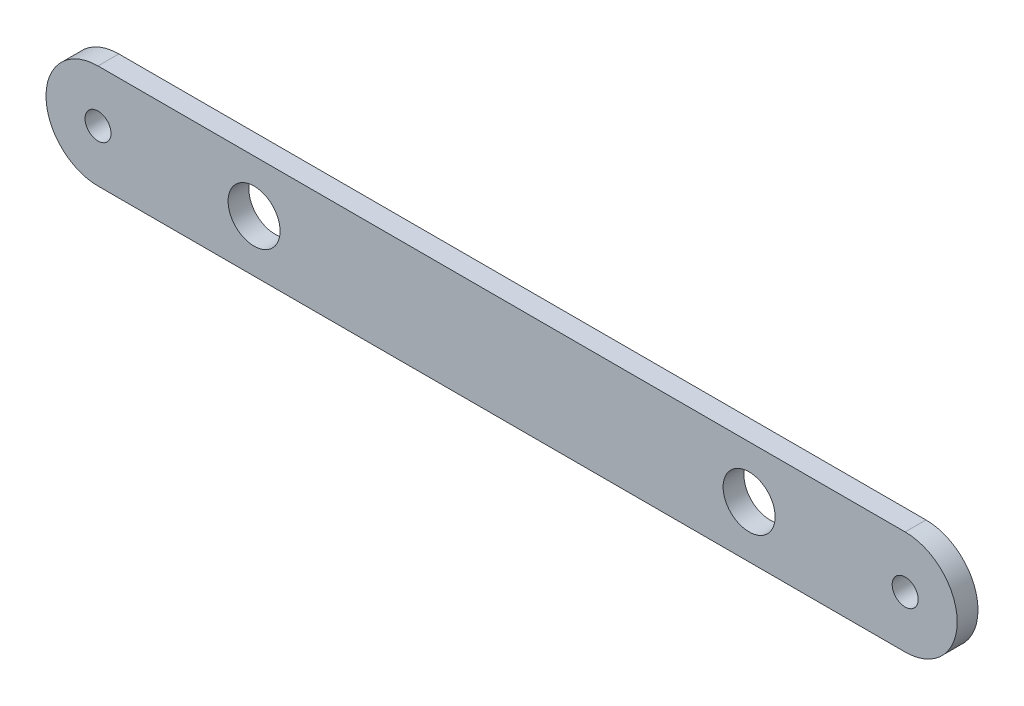
ISO-10303-21;
HEADER;
FILE_DESCRIPTION(('STEP AP214'),'2;1');
FILE_NAME('part.step','',(''),(''),'','','');
FILE_SCHEMA(('AUTOMOTIVE_DESIGN { 1 0 10303 214 1 1 1 1 }'));
ENDSEC;
DATA;
#1=APPLICATION_CONTEXT('core data for automotive mechanical design processes');
#2=APPLICATION_PROTOCOL_DEFINITION('international standard','automotive_design',2000,#1);
#3=PRODUCT_CONTEXT('',#1,'mechanical');
#4=PRODUCT('Part','Part','',(#3));
#5=PRODUCT_RELATED_PRODUCT_CATEGORY('part','',(#4));
#6=PRODUCT_DEFINITION_FORMATION('','',#4);
#7=PRODUCT_DEFINITION_CONTEXT('part definition',#1,'design');
#8=PRODUCT_DEFINITION('design','',#6,#7);
#9=PRODUCT_DEFINITION_SHAPE('','',#8);
#10=(LENGTH_UNIT() NAMED_UNIT(*) SI_UNIT(.MILLI.,.METRE.));
#11=(NAMED_UNIT(*) PLANE_ANGLE_UNIT() SI_UNIT($,.RADIAN.));
#12=(NAMED_UNIT(*) SI_UNIT($,.STERADIAN.) SOLID_ANGLE_UNIT());
#13=UNCERTAINTY_MEASURE_WITH_UNIT(LENGTH_MEASURE(1.E-05),#10,'distance_accuracy_value','');
#14=(GEOMETRIC_REPRESENTATION_CONTEXT(3) GLOBAL_UNCERTAINTY_ASSIGNED_CONTEXT((#13)) GLOBAL_UNIT_ASSIGNED_CONTEXT((#10,
#11,#12)) REPRESENTATION_CONTEXT('',''));
#15=CARTESIAN_POINT('',(0.,0.,0.));
#16=DIRECTION('',(0.,0.,1.));
#17=DIRECTION('',(1.,0.,0.));
#18=AXIS2_PLACEMENT_3D('',#15,#16,#17);
#19=CARTESIAN_POINT('',(0.,0.,2.54));
#20=DIRECTION('',(0.,0.,-1.));
#21=DIRECTION('',(-1.,0.,0.));
#22=AXIS2_PLACEMENT_3D('',#19,#20,#21);
#23=CYLINDRICAL_SURFACE('',#22,6.35);
#24=CARTESIAN_POINT('',(0.,0.,0.));
#25=DIRECTION('',(0.,0.,1.));
#26=DIRECTION('',(1.,0.,0.));
#27=AXIS2_PLACEMENT_3D('',#24,#25,#26);
#28=CIRCLE('',#27,6.35);
#29=CARTESIAN_POINT('',(0.,6.35,0.));
#30=VERTEX_POINT('',#29);
#31=CARTESIAN_POINT('',(0.,-6.35,0.));
#32=VERTEX_POINT('',#31);
#33=EDGE_CURVE('E122',#30,#32,#28,.T.);
#34=ORIENTED_EDGE('',*,*,#33,.T.);
#35=DIRECTION('',(0.,0.,-1.));
#36=VECTOR('',#35,1.);
#37=CARTESIAN_POINT('',(0.,-6.35,2.54));
#38=LINE('',#37,#36);
#39=CARTESIAN_POINT('',(0.,-6.35,2.54));
#40=VERTEX_POINT('',#39);
#41=EDGE_CURVE('E11',#40,#32,#38,.T.);
#42=ORIENTED_EDGE('',*,*,#41,.F.);
#43=CARTESIAN_POINT('',(0.,0.,2.54));
#44=DIRECTION('',(0.,0.,1.));
#45=DIRECTION('',(1.,0.,0.));
#46=AXIS2_PLACEMENT_3D('',#43,#44,#45);
#47=CIRCLE('',#46,6.35);
#48=CARTESIAN_POINT('',(0.,6.35,2.54));
#49=VERTEX_POINT('',#48);
#50=EDGE_CURVE('E93',#49,#40,#47,.T.);
#51=ORIENTED_EDGE('',*,*,#50,.F.);
#52=DIRECTION('',(0.,0.,-1.));
#53=VECTOR('',#52,1.);
#54=CARTESIAN_POINT('',(0.,6.35,2.54));
#55=LINE('',#54,#53);
#56=EDGE_CURVE('E59',#49,#30,#55,.T.);
#57=ORIENTED_EDGE('',*,*,#56,.T.);
#58=EDGE_LOOP('',(#34,#42,#51,#57));
#59=FACE_BOUND('',#58,.T.);
#60=ADVANCED_FACE('F42',(#59),#23,.T.);
#61=CARTESIAN_POINT('',(0.,-6.35,2.54));
#62=DIRECTION('',(0.,1.,0.));
#63=DIRECTION('',(0.,0.,1.));
#64=AXIS2_PLACEMENT_3D('',#61,#62,#63);
#65=PLANE('',#64);
#66=DIRECTION('',(1.,0.,0.));
#67=VECTOR('',#66,1.);
#68=CARTESIAN_POINT('',(0.,-6.35,0.));
#69=LINE('',#68,#67);
#70=CARTESIAN_POINT('',(98.5266,-6.35,0.));
#71=VERTEX_POINT('',#70);
#72=EDGE_CURVE('E98',#32,#71,#69,.T.);
#73=ORIENTED_EDGE('',*,*,#72,.T.);
#74=DIRECTION('',(0.,0.,-1.));
#75=VECTOR('',#74,1.);
#76=CARTESIAN_POINT('',(98.5266,-6.35,2.54));
#77=LINE('',#76,#75);
#78=CARTESIAN_POINT('',(98.5266,-6.35,2.54));
#79=VERTEX_POINT('',#78);
#80=EDGE_CURVE('E51',#79,#71,#77,.T.);
#81=ORIENTED_EDGE('',*,*,#80,.F.);
#82=DIRECTION('',(1.,0.,0.));
#83=VECTOR('',#82,1.);
#84=CARTESIAN_POINT('',(0.,-6.35,2.54));
#85=LINE('',#84,#83);
#86=EDGE_CURVE('E85',#40,#79,#85,.T.);
#87=ORIENTED_EDGE('',*,*,#86,.F.);
#88=ORIENTED_EDGE('',*,*,#41,.T.);
#89=EDGE_LOOP('',(#73,#81,#87,#88));
#90=FACE_BOUND('',#89,.T.);
#91=ADVANCED_FACE('F97',(#90),#65,.F.);
#92=CARTESIAN_POINT('',(98.5266,0.,2.54));
#93=DIRECTION('',(0.,0.,-1.));
#94=DIRECTION('',(-1.,0.,0.));
#95=AXIS2_PLACEMENT_3D('',#92,#93,#94);
#96=CYLINDRICAL_SURFACE('',#95,6.35);
#97=CARTESIAN_POINT('',(98.5266,0.,0.));
#98=DIRECTION('',(0.,0.,1.));
#99=DIRECTION('',(1.,0.,0.));
#100=AXIS2_PLACEMENT_3D('',#97,#98,#99);
#101=CIRCLE('',#100,6.35);
#102=CARTESIAN_POINT('',(98.5266,6.35,0.));
#103=VERTEX_POINT('',#102);
#104=EDGE_CURVE('E125',#71,#103,#101,.T.);
#105=ORIENTED_EDGE('',*,*,#104,.T.);
#106=DIRECTION('',(0.,0.,-1.));
#107=VECTOR('',#106,1.);
#108=CARTESIAN_POINT('',(98.5266,6.35,2.54));
#109=LINE('',#108,#107);
#110=CARTESIAN_POINT('',(98.5266,6.35,2.54));
#111=VERTEX_POINT('',#110);
#112=EDGE_CURVE('E74',#111,#103,#109,.T.);
#113=ORIENTED_EDGE('',*,*,#112,.F.);
#114=CARTESIAN_POINT('',(98.5266,0.,2.54));
#115=DIRECTION('',(0.,0.,1.));
#116=DIRECTION('',(1.,0.,0.));
#117=AXIS2_PLACEMENT_3D('',#114,#115,#116);
#118=CIRCLE('',#117,6.35);
#119=EDGE_CURVE('E92',#79,#111,#118,.T.);
#120=ORIENTED_EDGE('',*,*,#119,.F.);
#121=ORIENTED_EDGE('',*,*,#80,.T.);
#122=EDGE_LOOP('',(#105,#113,#120,#121));
#123=FACE_BOUND('',#122,.T.);
#124=ADVANCED_FACE('F101',(#123),#96,.T.);
#125=CARTESIAN_POINT('',(19.05,0.,2.54));
#126=DIRECTION('',(0.,0.,-1.));
#127=DIRECTION('',(-1.,0.,0.));
#128=AXIS2_PLACEMENT_3D('',#125,#126,#127);
#129=CYLINDRICAL_SURFACE('',#128,3.175);
#130=CARTESIAN_POINT('',(19.05,0.,2.54));
#131=DIRECTION('',(0.,0.,1.));
#132=DIRECTION('',(1.,0.,0.));
#133=AXIS2_PLACEMENT_3D('',#130,#131,#132);
#134=CIRCLE('',#133,3.175);
#135=CARTESIAN_POINT('',(22.225,0.,2.54));
#136=VERTEX_POINT('',#135);
#137=EDGE_CURVE('E111',#136,#136,#134,.T.);
#138=ORIENTED_EDGE('',*,*,#137,.T.);
#139=EDGE_LOOP('',(#138));
#140=FACE_BOUND('',#139,.T.);
#141=CARTESIAN_POINT('',(19.05,0.,0.));
#142=DIRECTION('',(0.,0.,1.));
#143=DIRECTION('',(1.,0.,0.));
#144=AXIS2_PLACEMENT_3D('',#141,#142,#143);
#145=CIRCLE('',#144,3.175);
#146=CARTESIAN_POINT('',(22.225,0.,0.));
#147=VERTEX_POINT('',#146);
#148=EDGE_CURVE('E133',#147,#147,#145,.T.);
#149=ORIENTED_EDGE('',*,*,#148,.F.);
#150=EDGE_LOOP('',(#149));
#151=FACE_BOUND('',#150,.T.);
#152=ADVANCED_FACE('F172',(#140,#151),#129,.F.);
#153=CARTESIAN_POINT('',(79.4766,0.,2.54));
#154=DIRECTION('',(0.,0.,-1.));
#155=DIRECTION('',(-1.,0.,0.));
#156=AXIS2_PLACEMENT_3D('',#153,#154,#155);
#157=CYLINDRICAL_SURFACE('',#156,3.175);
#158=CARTESIAN_POINT('',(79.4766,0.,2.54));
#159=DIRECTION('',(0.,0.,1.));
#160=DIRECTION('',(1.,0.,0.));
#161=AXIS2_PLACEMENT_3D('',#158,#159,#160);
#162=CIRCLE('',#161,3.175);
#163=CARTESIAN_POINT('',(82.6516,0.,2.54));
#164=VERTEX_POINT('',#163);
#165=EDGE_CURVE('E104',#164,#164,#162,.T.);
#166=ORIENTED_EDGE('',*,*,#165,.T.);
#167=EDGE_LOOP('',(#166));
#168=FACE_BOUND('',#167,.T.);
#169=CARTESIAN_POINT('',(79.4766,0.,0.));
#170=DIRECTION('',(0.,0.,1.));
#171=DIRECTION('',(1.,0.,0.));
#172=AXIS2_PLACEMENT_3D('',#169,#170,#171);
#173=CIRCLE('',#172,3.175);
#174=CARTESIAN_POINT('',(82.6516,0.,0.));
#175=VERTEX_POINT('',#174);
#176=EDGE_CURVE('E130',#175,#175,#173,.T.);
#177=ORIENTED_EDGE('',*,*,#176,.F.);
#178=EDGE_LOOP('',(#177));
#179=FACE_BOUND('',#178,.T.);
#180=ADVANCED_FACE('F176',(#168,#179),#157,.F.);
#181=CARTESIAN_POINT('',(0.,6.35,2.54));
#182=DIRECTION('',(0.,1.,0.));
#183=DIRECTION('',(0.,0.,1.));
#184=AXIS2_PLACEMENT_3D('',#181,#182,#183);
#185=PLANE('',#184);
#186=DIRECTION('',(1.,0.,0.));
#187=VECTOR('',#186,1.);
#188=CARTESIAN_POINT('',(0.,6.35,0.));
#189=LINE('',#188,#187);
#190=EDGE_CURVE('E127',#30,#103,#189,.T.);
#191=ORIENTED_EDGE('',*,*,#190,.F.);
#192=ORIENTED_EDGE('',*,*,#56,.F.);
#193=DIRECTION('',(1.,0.,0.));
#194=VECTOR('',#193,1.);
#195=CARTESIAN_POINT('',(0.,6.35,2.54));
#196=LINE('',#195,#194);
#197=EDGE_CURVE('E102',#49,#111,#196,.T.);
#198=ORIENTED_EDGE('',*,*,#197,.T.);
#199=ORIENTED_EDGE('',*,*,#112,.T.);
#200=EDGE_LOOP('',(#191,#192,#198,#199));
#201=FACE_BOUND('',#200,.T.);
#202=ADVANCED_FACE('F173',(#201),#185,.T.);
#203=CARTESIAN_POINT('',(0.,0.,2.54));
#204=DIRECTION('',(0.,0.,-1.));
#205=DIRECTION('',(-1.,0.,0.));
#206=AXIS2_PLACEMENT_3D('',#203,#204,#205);
#207=CYLINDRICAL_SURFACE('',#206,1.5875);
#208=CARTESIAN_POINT('',(0.,0.,2.54));
#209=DIRECTION('',(0.,0.,1.));
#210=DIRECTION('',(1.,0.,0.));
#211=AXIS2_PLACEMENT_3D('',#208,#209,#210);
#212=CIRCLE('',#211,1.5875);
#213=CARTESIAN_POINT('',(1.5875,0.,2.54));
#214=VERTEX_POINT('',#213);
#215=EDGE_CURVE('E140',#214,#214,#212,.T.);
#216=ORIENTED_EDGE('',*,*,#215,.T.);
#217=EDGE_LOOP('',(#216));
#218=FACE_BOUND('',#217,.T.);
#219=CARTESIAN_POINT('',(0.,0.,0.));
#220=DIRECTION('',(0.,0.,1.));
#221=DIRECTION('',(1.,0.,0.));
#222=AXIS2_PLACEMENT_3D('',#219,#220,#221);
#223=CIRCLE('',#222,1.5875);
#224=CARTESIAN_POINT('',(1.5875,0.,0.));
#225=VERTEX_POINT('',#224);
#226=EDGE_CURVE('E118',#225,#225,#223,.T.);
#227=ORIENTED_EDGE('',*,*,#226,.F.);
#228=EDGE_LOOP('',(#227));
#229=FACE_BOUND('',#228,.T.);
#230=ADVANCED_FACE('F44',(#218,#229),#207,.F.);
#231=CARTESIAN_POINT('',(98.5266,0.,2.54));
#232=DIRECTION('',(0.,0.,-1.));
#233=DIRECTION('',(-1.,0.,0.));
#234=AXIS2_PLACEMENT_3D('',#231,#232,#233);
#235=CYLINDRICAL_SURFACE('',#234,1.5875);
#236=CARTESIAN_POINT('',(98.5266,0.,2.54));
#237=DIRECTION('',(0.,0.,1.));
#238=DIRECTION('',(1.,0.,0.));
#239=AXIS2_PLACEMENT_3D('',#236,#237,#238);
#240=CIRCLE('',#239,1.5875);
#241=CARTESIAN_POINT('',(100.1141,0.,2.54));
#242=VERTEX_POINT('',#241);
#243=EDGE_CURVE('E115',#242,#242,#240,.T.);
#244=ORIENTED_EDGE('',*,*,#243,.T.);
#245=EDGE_LOOP('',(#244));
#246=FACE_BOUND('',#245,.T.);
#247=CARTESIAN_POINT('',(98.5266,0.,0.));
#248=DIRECTION('',(0.,0.,1.));
#249=DIRECTION('',(1.,0.,0.));
#250=AXIS2_PLACEMENT_3D('',#247,#248,#249);
#251=CIRCLE('',#250,1.5875);
#252=CARTESIAN_POINT('',(100.1141,0.,0.));
#253=VERTEX_POINT('',#252);
#254=EDGE_CURVE('E136',#253,#253,#251,.T.);
#255=ORIENTED_EDGE('',*,*,#254,.F.);
#256=EDGE_LOOP('',(#255));
#257=FACE_BOUND('',#256,.T.);
#258=ADVANCED_FACE('F154',(#246,#257),#235,.F.);
#259=CARTESIAN_POINT('',(0.,0.,2.54));
#260=DIRECTION('',(0.,0.,1.));
#261=DIRECTION('',(1.,0.,0.));
#262=AXIS2_PLACEMENT_3D('',#259,#260,#261);
#263=PLANE('',#262);
#264=ORIENTED_EDGE('',*,*,#215,.F.);
#265=EDGE_LOOP('',(#264));
#266=FACE_BOUND('',#265,.T.);
#267=ORIENTED_EDGE('',*,*,#50,.T.);
#268=ORIENTED_EDGE('',*,*,#86,.T.);
#269=ORIENTED_EDGE('',*,*,#119,.T.);
#270=ORIENTED_EDGE('',*,*,#197,.F.);
#271=EDGE_LOOP('',(#267,#268,#269,#270));
#272=FACE_BOUND('',#271,.T.);
#273=ORIENTED_EDGE('',*,*,#165,.F.);
#274=EDGE_LOOP('',(#273));
#275=FACE_BOUND('',#274,.T.);
#276=ORIENTED_EDGE('',*,*,#137,.F.);
#277=EDGE_LOOP('',(#276));
#278=FACE_BOUND('',#277,.T.);
#279=ORIENTED_EDGE('',*,*,#243,.F.);
#280=EDGE_LOOP('',(#279));
#281=FACE_BOUND('',#280,.T.);
#282=ADVANCED_FACE('F88',(#266,#272,#275,#278,#281),#263,.T.);
#283=CARTESIAN_POINT('',(0.,0.,0.));
#284=DIRECTION('',(0.,0.,1.));
#285=DIRECTION('',(1.,0.,0.));
#286=AXIS2_PLACEMENT_3D('',#283,#284,#285);
#287=PLANE('',#286);
#288=ORIENTED_EDGE('',*,*,#226,.T.);
#289=EDGE_LOOP('',(#288));
#290=FACE_BOUND('',#289,.T.);
#291=ORIENTED_EDGE('',*,*,#33,.F.);
#292=ORIENTED_EDGE('',*,*,#190,.T.);
#293=ORIENTED_EDGE('',*,*,#104,.F.);
#294=ORIENTED_EDGE('',*,*,#72,.F.);
#295=EDGE_LOOP('',(#291,#292,#293,#294));
#296=FACE_BOUND('',#295,.T.);
#297=ORIENTED_EDGE('',*,*,#176,.T.);
#298=EDGE_LOOP('',(#297));
#299=FACE_BOUND('',#298,.T.);
#300=ORIENTED_EDGE('',*,*,#148,.T.);
#301=EDGE_LOOP('',(#300));
#302=FACE_BOUND('',#301,.T.);
#303=ORIENTED_EDGE('',*,*,#254,.T.);
#304=EDGE_LOOP('',(#303));
#305=FACE_BOUND('',#304,.T.);
#306=ADVANCED_FACE('F153',(#290,#296,#299,#302,#305),#287,.F.);
#307=CLOSED_SHELL('',(#60,#91,#124,#152,#180,#202,#230,#258,#282,#306));
#308=MANIFOLD_SOLID_BREP('B2',#307);
#309=ADVANCED_BREP_SHAPE_REPRESENTATION('',(#18,#308),#14);
#310=SHAPE_DEFINITION_REPRESENTATION(#9,#309);
ENDSEC;
END-ISO-10303-21;
